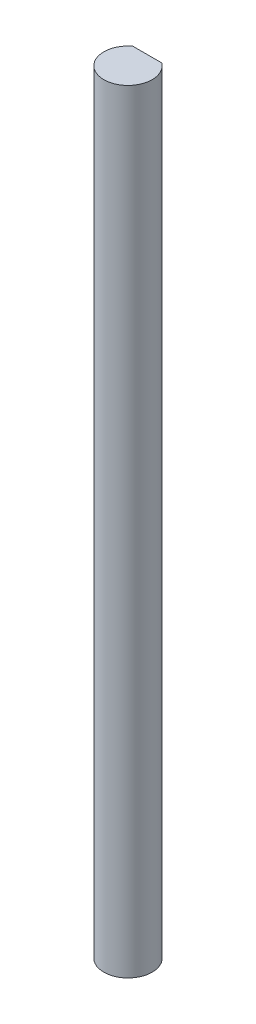
ISO-10303-21;
HEADER;
FILE_DESCRIPTION(('STEP AP214'),'2;1');
FILE_NAME('part.step','',(''),(''),'','','');
FILE_SCHEMA(('AUTOMOTIVE_DESIGN { 1 0 10303 214 1 1 1 1 }'));
ENDSEC;
DATA;
#1=APPLICATION_CONTEXT('core data for automotive mechanical design processes');
#2=APPLICATION_PROTOCOL_DEFINITION('international standard','automotive_design',2000,#1);
#3=PRODUCT_CONTEXT('',#1,'mechanical');
#4=PRODUCT('Part','Part','',(#3));
#5=PRODUCT_RELATED_PRODUCT_CATEGORY('part','',(#4));
#6=PRODUCT_DEFINITION_FORMATION('','',#4);
#7=PRODUCT_DEFINITION_CONTEXT('part definition',#1,'design');
#8=PRODUCT_DEFINITION('design','',#6,#7);
#9=PRODUCT_DEFINITION_SHAPE('','',#8);
#10=(LENGTH_UNIT() NAMED_UNIT(*) SI_UNIT(.MILLI.,.METRE.));
#11=(NAMED_UNIT(*) PLANE_ANGLE_UNIT() SI_UNIT($,.RADIAN.));
#12=(NAMED_UNIT(*) SI_UNIT($,.STERADIAN.) SOLID_ANGLE_UNIT());
#13=UNCERTAINTY_MEASURE_WITH_UNIT(LENGTH_MEASURE(1.E-05),#10,'distance_accuracy_value','');
#14=(GEOMETRIC_REPRESENTATION_CONTEXT(3) GLOBAL_UNCERTAINTY_ASSIGNED_CONTEXT((#13)) GLOBAL_UNIT_ASSIGNED_CONTEXT((#10,
#11,#12)) REPRESENTATION_CONTEXT('',''));
#15=CARTESIAN_POINT('',(0.,0.,0.));
#16=DIRECTION('',(0.,0.,1.));
#17=DIRECTION('',(1.,0.,0.));
#18=AXIS2_PLACEMENT_3D('',#15,#16,#17);
#19=CARTESIAN_POINT('',(0.,101.6,0.));
#20=DIRECTION('',(0.,-1.,0.));
#21=DIRECTION('',(0.,0.,-1.));
#22=AXIS2_PLACEMENT_3D('',#19,#20,#21);
#23=CYLINDRICAL_SURFACE('',#22,3.175);
#24=CARTESIAN_POINT('',(0.,101.6,0.));
#25=DIRECTION('',(0.,1.,0.));
#26=DIRECTION('',(0.,0.,1.));
#27=AXIS2_PLACEMENT_3D('',#24,#25,#26);
#28=CIRCLE('',#27,3.175);
#29=CARTESIAN_POINT('',(-1.905,101.6,-2.54));
#30=VERTEX_POINT('',#29);
#31=CARTESIAN_POINT('',(1.905,101.6,-2.54));
#32=VERTEX_POINT('',#31);
#33=EDGE_CURVE('E11',#30,#32,#28,.T.);
#34=ORIENTED_EDGE('',*,*,#33,.F.);
#35=DIRECTION('',(0.,-1.,0.));
#36=VECTOR('',#35,1.);
#37=CARTESIAN_POINT('',(-1.905,101.6,-2.54));
#38=LINE('',#37,#36);
#39=CARTESIAN_POINT('',(-1.905,0.,-2.54));
#40=VERTEX_POINT('',#39);
#41=EDGE_CURVE('E60',#30,#40,#38,.T.);
#42=ORIENTED_EDGE('',*,*,#41,.T.);
#43=CARTESIAN_POINT('',(0.,0.,0.));
#44=DIRECTION('',(0.,1.,0.));
#45=DIRECTION('',(0.,0.,1.));
#46=AXIS2_PLACEMENT_3D('',#43,#44,#45);
#47=CIRCLE('',#46,3.175);
#48=CARTESIAN_POINT('',(1.905,0.,-2.54));
#49=VERTEX_POINT('',#48);
#50=EDGE_CURVE('E42',#40,#49,#47,.T.);
#51=ORIENTED_EDGE('',*,*,#50,.T.);
#52=DIRECTION('',(0.,-1.,0.));
#53=VECTOR('',#52,1.);
#54=CARTESIAN_POINT('',(1.905,101.6,-2.54));
#55=LINE('',#54,#53);
#56=EDGE_CURVE('E54',#32,#49,#55,.T.);
#57=ORIENTED_EDGE('',*,*,#56,.F.);
#58=EDGE_LOOP('',(#34,#42,#51,#57));
#59=FACE_BOUND('',#58,.T.);
#60=ADVANCED_FACE('F39',(#59),#23,.T.);
#61=CARTESIAN_POINT('',(0.,101.6,0.));
#62=DIRECTION('',(0.,1.,0.));
#63=DIRECTION('',(0.,0.,1.));
#64=AXIS2_PLACEMENT_3D('',#61,#62,#63);
#65=PLANE('',#64);
#66=DIRECTION('',(-1.,0.,0.));
#67=VECTOR('',#66,1.);
#68=CARTESIAN_POINT('',(1.905,101.6,-2.54));
#69=LINE('',#68,#67);
#70=EDGE_CURVE('E70',#32,#30,#69,.T.);
#71=ORIENTED_EDGE('',*,*,#70,.T.);
#72=ORIENTED_EDGE('',*,*,#33,.T.);
#73=EDGE_LOOP('',(#71,#72));
#74=FACE_BOUND('',#73,.T.);
#75=ADVANCED_FACE('F83',(#74),#65,.T.);
#76=CARTESIAN_POINT('',(0.,0.,0.));
#77=DIRECTION('',(0.,1.,0.));
#78=DIRECTION('',(0.,0.,1.));
#79=AXIS2_PLACEMENT_3D('',#76,#77,#78);
#80=PLANE('',#79);
#81=ORIENTED_EDGE('',*,*,#50,.F.);
#82=DIRECTION('',(-1.,0.,0.));
#83=VECTOR('',#82,1.);
#84=CARTESIAN_POINT('',(1.905,0.,-2.54));
#85=LINE('',#84,#83);
#86=EDGE_CURVE('E64',#49,#40,#85,.T.);
#87=ORIENTED_EDGE('',*,*,#86,.F.);
#88=EDGE_LOOP('',(#81,#87));
#89=FACE_BOUND('',#88,.T.);
#90=ADVANCED_FACE('F76',(#89),#80,.F.);
#91=CARTESIAN_POINT('',(1.905,101.6,-2.54));
#92=DIRECTION('',(0.,0.,1.));
#93=DIRECTION('',(1.,0.,0.));
#94=AXIS2_PLACEMENT_3D('',#91,#92,#93);
#95=PLANE('',#94);
#96=ORIENTED_EDGE('',*,*,#86,.T.);
#97=ORIENTED_EDGE('',*,*,#41,.F.);
#98=ORIENTED_EDGE('',*,*,#70,.F.);
#99=ORIENTED_EDGE('',*,*,#56,.T.);
#100=EDGE_LOOP('',(#96,#97,#98,#99));
#101=FACE_BOUND('',#100,.T.);
#102=ADVANCED_FACE('F65',(#101),#95,.F.);
#103=CLOSED_SHELL('',(#60,#75,#90,#102));
#104=MANIFOLD_SOLID_BREP('B2',#103);
#105=ADVANCED_BREP_SHAPE_REPRESENTATION('',(#18,#104),#14);
#106=SHAPE_DEFINITION_REPRESENTATION(#9,#105);
ENDSEC;
END-ISO-10303-21;
